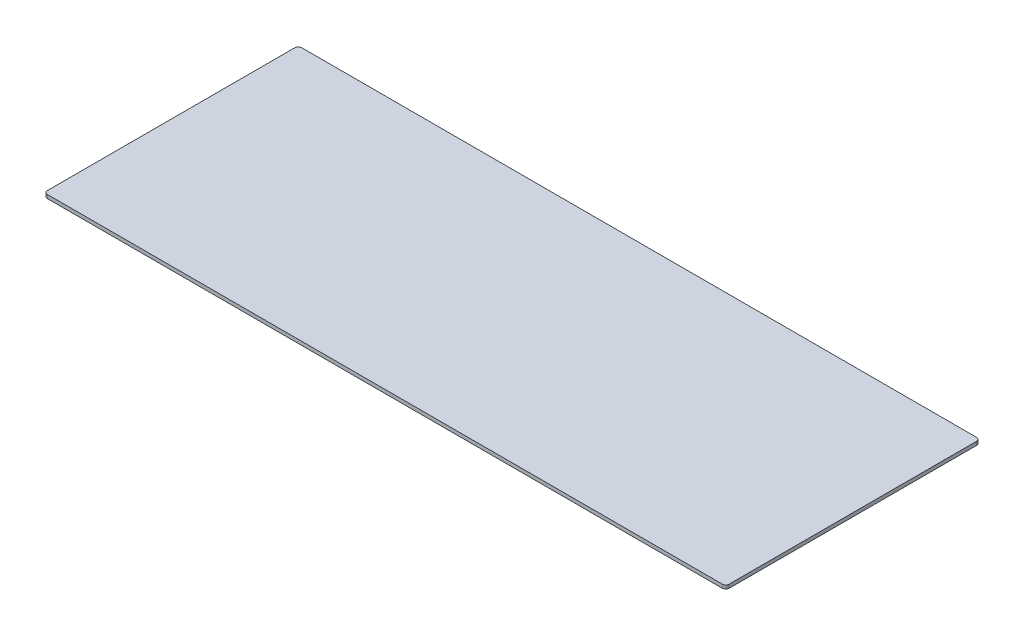
ISO-10303-21;
HEADER;
FILE_DESCRIPTION(('STEP AP214'),'2;1');
FILE_NAME('part.step','',(''),(''),'','','');
FILE_SCHEMA(('AUTOMOTIVE_DESIGN { 1 0 10303 214 1 1 1 1 }'));
ENDSEC;
DATA;
#1=APPLICATION_CONTEXT('core data for automotive mechanical design processes');
#2=APPLICATION_PROTOCOL_DEFINITION('international standard','automotive_design',2000,#1);
#3=PRODUCT_CONTEXT('',#1,'mechanical');
#4=PRODUCT('Part','Part','',(#3));
#5=PRODUCT_RELATED_PRODUCT_CATEGORY('part','',(#4));
#6=PRODUCT_DEFINITION_FORMATION('','',#4);
#7=PRODUCT_DEFINITION_CONTEXT('part definition',#1,'design');
#8=PRODUCT_DEFINITION('design','',#6,#7);
#9=PRODUCT_DEFINITION_SHAPE('','',#8);
#10=(LENGTH_UNIT() NAMED_UNIT(*) SI_UNIT(.MILLI.,.METRE.));
#11=(NAMED_UNIT(*) PLANE_ANGLE_UNIT() SI_UNIT($,.RADIAN.));
#12=(NAMED_UNIT(*) SI_UNIT($,.STERADIAN.) SOLID_ANGLE_UNIT());
#13=UNCERTAINTY_MEASURE_WITH_UNIT(LENGTH_MEASURE(1.E-05),#10,'distance_accuracy_value','');
#14=(GEOMETRIC_REPRESENTATION_CONTEXT(3) GLOBAL_UNCERTAINTY_ASSIGNED_CONTEXT((#13)) GLOBAL_UNIT_ASSIGNED_CONTEXT((#10,
#11,#12)) REPRESENTATION_CONTEXT('',''));
#15=CARTESIAN_POINT('',(0.,0.,0.));
#16=DIRECTION('',(0.,0.,1.));
#17=DIRECTION('',(1.,0.,0.));
#18=AXIS2_PLACEMENT_3D('',#15,#16,#17);
#19=CARTESIAN_POINT('',(25.2806257218328,1.6,113.));
#20=DIRECTION('',(1.,0.,0.));
#21=DIRECTION('',(0.,0.,-1.));
#22=AXIS2_PLACEMENT_3D('',#19,#20,#21);
#23=PLANE('',#22);
#24=DIRECTION('',(0.,0.,1.));
#25=VECTOR('',#24,1.);
#26=CARTESIAN_POINT('',(25.2806257218328,1.6,113.));
#27=LINE('',#26,#25);
#28=CARTESIAN_POINT('',(25.2806257218328,1.6,1.5));
#29=VERTEX_POINT('',#28);
#30=CARTESIAN_POINT('',(25.2806257218328,1.6,111.5));
#31=VERTEX_POINT('',#30);
#32=EDGE_CURVE('E130',#29,#31,#27,.T.);
#33=ORIENTED_EDGE('',*,*,#32,.F.);
#34=DIRECTION('',(0.,-1.,0.));
#35=VECTOR('',#34,1.);
#36=CARTESIAN_POINT('',(25.2806257218328,1.6,1.5));
#37=LINE('',#36,#35);
#38=CARTESIAN_POINT('',(25.2806257218328,0.,1.5));
#39=VERTEX_POINT('',#38);
#40=EDGE_CURVE('E11',#29,#39,#37,.T.);
#41=ORIENTED_EDGE('',*,*,#40,.T.);
#42=DIRECTION('',(0.,0.,1.));
#43=VECTOR('',#42,1.);
#44=CARTESIAN_POINT('',(25.2806257218328,0.,113.));
#45=LINE('',#44,#43);
#46=CARTESIAN_POINT('',(25.2806257218328,0.,111.5));
#47=VERTEX_POINT('',#46);
#48=EDGE_CURVE('E161',#39,#47,#45,.T.);
#49=ORIENTED_EDGE('',*,*,#48,.T.);
#50=DIRECTION('',(0.,-1.,0.));
#51=VECTOR('',#50,1.);
#52=CARTESIAN_POINT('',(25.2806257218328,1.6,111.5));
#53=LINE('',#52,#51);
#54=EDGE_CURVE('E44',#47,#31,#53,.F.);
#55=ORIENTED_EDGE('',*,*,#54,.T.);
#56=EDGE_LOOP('',(#33,#41,#49,#55));
#57=FACE_BOUND('',#56,.T.);
#58=ADVANCED_FACE('F36',(#57),#23,.F.);
#59=CARTESIAN_POINT('',(328.280625721833,1.6,113.));
#60=DIRECTION('',(0.,0.,-1.));
#61=DIRECTION('',(-1.,0.,0.));
#62=AXIS2_PLACEMENT_3D('',#59,#60,#61);
#63=PLANE('',#62);
#64=DIRECTION('',(1.,0.,0.));
#65=VECTOR('',#64,1.);
#66=CARTESIAN_POINT('',(328.280625721833,0.,113.));
#67=LINE('',#66,#65);
#68=CARTESIAN_POINT('',(26.7806257218328,0.,113.));
#69=VERTEX_POINT('',#68);
#70=CARTESIAN_POINT('',(326.780625721833,0.,113.));
#71=VERTEX_POINT('',#70);
#72=EDGE_CURVE('E135',#69,#71,#67,.T.);
#73=ORIENTED_EDGE('',*,*,#72,.T.);
#74=DIRECTION('',(0.,-1.,0.));
#75=VECTOR('',#74,1.);
#76=CARTESIAN_POINT('',(326.780625721833,1.6,113.));
#77=LINE('',#76,#75);
#78=CARTESIAN_POINT('',(326.780625721833,1.6,113.));
#79=VERTEX_POINT('',#78);
#80=EDGE_CURVE('E51',#71,#79,#77,.F.);
#81=ORIENTED_EDGE('',*,*,#80,.T.);
#82=DIRECTION('',(1.,0.,0.));
#83=VECTOR('',#82,1.);
#84=CARTESIAN_POINT('',(328.280625721833,1.6,113.));
#85=LINE('',#84,#83);
#86=CARTESIAN_POINT('',(26.7806257218328,1.6,113.));
#87=VERTEX_POINT('',#86);
#88=EDGE_CURVE('E133',#87,#79,#85,.T.);
#89=ORIENTED_EDGE('',*,*,#88,.F.);
#90=DIRECTION('',(0.,-1.,0.));
#91=VECTOR('',#90,1.);
#92=CARTESIAN_POINT('',(26.7806257218328,1.6,113.));
#93=LINE('',#92,#91);
#94=EDGE_CURVE('E153',#87,#69,#93,.T.);
#95=ORIENTED_EDGE('',*,*,#94,.T.);
#96=EDGE_LOOP('',(#73,#81,#89,#95));
#97=FACE_BOUND('',#96,.T.);
#98=ADVANCED_FACE('F168',(#97),#63,.F.);
#99=CARTESIAN_POINT('',(328.280625721833,1.6,0.));
#100=DIRECTION('',(-1.,0.,0.));
#101=DIRECTION('',(0.,0.,1.));
#102=AXIS2_PLACEMENT_3D('',#99,#100,#101);
#103=PLANE('',#102);
#104=DIRECTION('',(0.,0.,-1.));
#105=VECTOR('',#104,1.);
#106=CARTESIAN_POINT('',(328.280625721833,0.,0.));
#107=LINE('',#106,#105);
#108=CARTESIAN_POINT('',(328.280625721833,0.,111.5));
#109=VERTEX_POINT('',#108);
#110=CARTESIAN_POINT('',(328.280625721833,0.,1.5));
#111=VERTEX_POINT('',#110);
#112=EDGE_CURVE('E131',#109,#111,#107,.T.);
#113=ORIENTED_EDGE('',*,*,#112,.T.);
#114=DIRECTION('',(0.,-1.,0.));
#115=VECTOR('',#114,1.);
#116=CARTESIAN_POINT('',(328.280625721833,1.6,1.5));
#117=LINE('',#116,#115);
#118=CARTESIAN_POINT('',(328.280625721833,1.6,1.5));
#119=VERTEX_POINT('',#118);
#120=EDGE_CURVE('E108',#111,#119,#117,.F.);
#121=ORIENTED_EDGE('',*,*,#120,.T.);
#122=DIRECTION('',(0.,0.,-1.));
#123=VECTOR('',#122,1.);
#124=CARTESIAN_POINT('',(328.280625721833,1.6,0.));
#125=LINE('',#124,#123);
#126=CARTESIAN_POINT('',(328.280625721833,1.6,111.5));
#127=VERTEX_POINT('',#126);
#128=EDGE_CURVE('E172',#127,#119,#125,.T.);
#129=ORIENTED_EDGE('',*,*,#128,.F.);
#130=DIRECTION('',(0.,-1.,0.));
#131=VECTOR('',#130,1.);
#132=CARTESIAN_POINT('',(328.280625721833,1.6,111.5));
#133=LINE('',#132,#131);
#134=EDGE_CURVE('E113',#127,#109,#133,.T.);
#135=ORIENTED_EDGE('',*,*,#134,.T.);
#136=EDGE_LOOP('',(#113,#121,#129,#135));
#137=FACE_BOUND('',#136,.T.);
#138=ADVANCED_FACE('F180',(#137),#103,.F.);
#139=CARTESIAN_POINT('',(25.2806257218328,1.6,0.));
#140=DIRECTION('',(0.,0.,1.));
#141=DIRECTION('',(1.,0.,0.));
#142=AXIS2_PLACEMENT_3D('',#139,#140,#141);
#143=PLANE('',#142);
#144=DIRECTION('',(-1.,0.,0.));
#145=VECTOR('',#144,1.);
#146=CARTESIAN_POINT('',(25.2806257218328,1.6,0.));
#147=LINE('',#146,#145);
#148=CARTESIAN_POINT('',(326.780625721833,1.6,0.));
#149=VERTEX_POINT('',#148);
#150=CARTESIAN_POINT('',(26.7806257218328,1.6,0.));
#151=VERTEX_POINT('',#150);
#152=EDGE_CURVE('E123',#149,#151,#147,.T.);
#153=ORIENTED_EDGE('',*,*,#152,.F.);
#154=DIRECTION('',(0.,-1.,0.));
#155=VECTOR('',#154,1.);
#156=CARTESIAN_POINT('',(326.780625721833,1.6,0.));
#157=LINE('',#156,#155);
#158=CARTESIAN_POINT('',(326.780625721833,0.,0.));
#159=VERTEX_POINT('',#158);
#160=EDGE_CURVE('E107',#149,#159,#157,.T.);
#161=ORIENTED_EDGE('',*,*,#160,.T.);
#162=DIRECTION('',(-1.,0.,0.));
#163=VECTOR('',#162,1.);
#164=CARTESIAN_POINT('',(25.2806257218328,0.,0.));
#165=LINE('',#164,#163);
#166=CARTESIAN_POINT('',(26.7806257218328,0.,0.));
#167=VERTEX_POINT('',#166);
#168=EDGE_CURVE('E120',#159,#167,#165,.T.);
#169=ORIENTED_EDGE('',*,*,#168,.T.);
#170=DIRECTION('',(0.,-1.,0.));
#171=VECTOR('',#170,1.);
#172=CARTESIAN_POINT('',(26.7806257218328,1.6,0.));
#173=LINE('',#172,#171);
#174=EDGE_CURVE('E125',#167,#151,#173,.F.);
#175=ORIENTED_EDGE('',*,*,#174,.T.);
#176=EDGE_LOOP('',(#153,#161,#169,#175));
#177=FACE_BOUND('',#176,.T.);
#178=ADVANCED_FACE('F119',(#177),#143,.F.);
#179=CARTESIAN_POINT('',(0.,1.6,0.));
#180=DIRECTION('',(0.,-1.,0.));
#181=DIRECTION('',(0.,0.,-1.));
#182=AXIS2_PLACEMENT_3D('',#179,#180,#181);
#183=PLANE('',#182);
#184=ORIENTED_EDGE('',*,*,#128,.T.);
#185=CARTESIAN_POINT('',(326.780625721833,1.6,1.5));
#186=DIRECTION('',(0.,-1.,0.));
#187=DIRECTION('',(0.,0.,-1.));
#188=AXIS2_PLACEMENT_3D('',#185,#186,#187);
#189=CIRCLE('',#188,1.5);
#190=EDGE_CURVE('E151',#119,#149,#189,.F.);
#191=ORIENTED_EDGE('',*,*,#190,.T.);
#192=ORIENTED_EDGE('',*,*,#152,.T.);
#193=CARTESIAN_POINT('',(26.7806257218328,1.6,1.5));
#194=DIRECTION('',(0.,-1.,0.));
#195=DIRECTION('',(0.,0.,-1.));
#196=AXIS2_PLACEMENT_3D('',#193,#194,#195);
#197=CIRCLE('',#196,1.5);
#198=EDGE_CURVE('E147',#151,#29,#197,.F.);
#199=ORIENTED_EDGE('',*,*,#198,.T.);
#200=ORIENTED_EDGE('',*,*,#32,.T.);
#201=CARTESIAN_POINT('',(26.7806257218328,1.6,111.5));
#202=DIRECTION('',(0.,-1.,0.));
#203=DIRECTION('',(0.,0.,-1.));
#204=AXIS2_PLACEMENT_3D('',#201,#202,#203);
#205=CIRCLE('',#204,1.5);
#206=EDGE_CURVE('E58',#31,#87,#205,.F.);
#207=ORIENTED_EDGE('',*,*,#206,.T.);
#208=ORIENTED_EDGE('',*,*,#88,.T.);
#209=CARTESIAN_POINT('',(326.780625721833,1.6,111.5));
#210=DIRECTION('',(0.,-1.,0.));
#211=DIRECTION('',(0.,0.,-1.));
#212=AXIS2_PLACEMENT_3D('',#209,#210,#211);
#213=CIRCLE('',#212,1.5);
#214=EDGE_CURVE('E149',#79,#127,#213,.F.);
#215=ORIENTED_EDGE('',*,*,#214,.T.);
#216=EDGE_LOOP('',(#184,#191,#192,#199,#200,#207,#208,#215));
#217=FACE_BOUND('',#216,.T.);
#218=ADVANCED_FACE('F164',(#217),#183,.F.);
#219=CARTESIAN_POINT('',(0.,0.,0.));
#220=DIRECTION('',(0.,-1.,0.));
#221=DIRECTION('',(0.,0.,-1.));
#222=AXIS2_PLACEMENT_3D('',#219,#220,#221);
#223=PLANE('',#222);
#224=ORIENTED_EDGE('',*,*,#168,.F.);
#225=CARTESIAN_POINT('',(326.780625721833,0.,1.5));
#226=DIRECTION('',(0.,-1.,0.));
#227=DIRECTION('',(0.,0.,-1.));
#228=AXIS2_PLACEMENT_3D('',#225,#226,#227);
#229=CIRCLE('',#228,1.5);
#230=EDGE_CURVE('E103',#159,#111,#229,.T.);
#231=ORIENTED_EDGE('',*,*,#230,.T.);
#232=ORIENTED_EDGE('',*,*,#112,.F.);
#233=CARTESIAN_POINT('',(326.780625721833,0.,111.5));
#234=DIRECTION('',(0.,-1.,0.));
#235=DIRECTION('',(0.,0.,-1.));
#236=AXIS2_PLACEMENT_3D('',#233,#234,#235);
#237=CIRCLE('',#236,1.5);
#238=EDGE_CURVE('E114',#109,#71,#237,.T.);
#239=ORIENTED_EDGE('',*,*,#238,.T.);
#240=ORIENTED_EDGE('',*,*,#72,.F.);
#241=CARTESIAN_POINT('',(26.7806257218328,0.,111.5));
#242=DIRECTION('',(0.,-1.,0.));
#243=DIRECTION('',(0.,0.,-1.));
#244=AXIS2_PLACEMENT_3D('',#241,#242,#243);
#245=CIRCLE('',#244,1.5);
#246=EDGE_CURVE('E124',#69,#47,#245,.T.);
#247=ORIENTED_EDGE('',*,*,#246,.T.);
#248=ORIENTED_EDGE('',*,*,#48,.F.);
#249=CARTESIAN_POINT('',(26.7806257218328,0.,1.5));
#250=DIRECTION('',(0.,-1.,0.));
#251=DIRECTION('',(0.,0.,-1.));
#252=AXIS2_PLACEMENT_3D('',#249,#250,#251);
#253=CIRCLE('',#252,1.5);
#254=EDGE_CURVE('E129',#39,#167,#253,.T.);
#255=ORIENTED_EDGE('',*,*,#254,.T.);
#256=EDGE_LOOP('',(#224,#231,#232,#239,#240,#247,#248,#255));
#257=FACE_BOUND('',#256,.T.);
#258=ADVANCED_FACE('F127',(#257),#223,.T.);
#259=CARTESIAN_POINT('',(326.780625721833,1.6,1.5));
#260=DIRECTION('',(0.,-1.,0.));
#261=DIRECTION('',(0.,0.,-1.));
#262=AXIS2_PLACEMENT_3D('',#259,#260,#261);
#263=CYLINDRICAL_SURFACE('',#262,1.5);
#264=ORIENTED_EDGE('',*,*,#190,.F.);
#265=ORIENTED_EDGE('',*,*,#120,.F.);
#266=ORIENTED_EDGE('',*,*,#230,.F.);
#267=ORIENTED_EDGE('',*,*,#160,.F.);
#268=EDGE_LOOP('',(#264,#265,#266,#267));
#269=FACE_BOUND('',#268,.T.);
#270=ADVANCED_FACE('F106',(#269),#263,.T.);
#271=CARTESIAN_POINT('',(326.780625721833,1.6,111.5));
#272=DIRECTION('',(0.,-1.,0.));
#273=DIRECTION('',(0.,0.,-1.));
#274=AXIS2_PLACEMENT_3D('',#271,#272,#273);
#275=CYLINDRICAL_SURFACE('',#274,1.5);
#276=ORIENTED_EDGE('',*,*,#214,.F.);
#277=ORIENTED_EDGE('',*,*,#80,.F.);
#278=ORIENTED_EDGE('',*,*,#238,.F.);
#279=ORIENTED_EDGE('',*,*,#134,.F.);
#280=EDGE_LOOP('',(#276,#277,#278,#279));
#281=FACE_BOUND('',#280,.T.);
#282=ADVANCED_FACE('F178',(#281),#275,.T.);
#283=CARTESIAN_POINT('',(26.7806257218328,1.6,1.5));
#284=DIRECTION('',(0.,-1.,0.));
#285=DIRECTION('',(0.,0.,-1.));
#286=AXIS2_PLACEMENT_3D('',#283,#284,#285);
#287=CYLINDRICAL_SURFACE('',#286,1.5);
#288=ORIENTED_EDGE('',*,*,#198,.F.);
#289=ORIENTED_EDGE('',*,*,#174,.F.);
#290=ORIENTED_EDGE('',*,*,#254,.F.);
#291=ORIENTED_EDGE('',*,*,#40,.F.);
#292=EDGE_LOOP('',(#288,#289,#290,#291));
#293=FACE_BOUND('',#292,.T.);
#294=ADVANCED_FACE('F182',(#293),#287,.T.);
#295=CARTESIAN_POINT('',(26.7806257218328,1.6,111.5));
#296=DIRECTION('',(0.,-1.,0.));
#297=DIRECTION('',(0.,0.,-1.));
#298=AXIS2_PLACEMENT_3D('',#295,#296,#297);
#299=CYLINDRICAL_SURFACE('',#298,1.5);
#300=ORIENTED_EDGE('',*,*,#206,.F.);
#301=ORIENTED_EDGE('',*,*,#54,.F.);
#302=ORIENTED_EDGE('',*,*,#246,.F.);
#303=ORIENTED_EDGE('',*,*,#94,.F.);
#304=EDGE_LOOP('',(#300,#301,#302,#303));
#305=FACE_BOUND('',#304,.T.);
#306=ADVANCED_FACE('F38',(#305),#299,.T.);
#307=CLOSED_SHELL('',(#58,#98,#138,#178,#218,#258,#270,#282,#294,#306));
#308=MANIFOLD_SOLID_BREP('B2',#307);
#309=ADVANCED_BREP_SHAPE_REPRESENTATION('',(#18,#308),#14);
#310=SHAPE_DEFINITION_REPRESENTATION(#9,#309);
ENDSEC;
END-ISO-10303-21;
